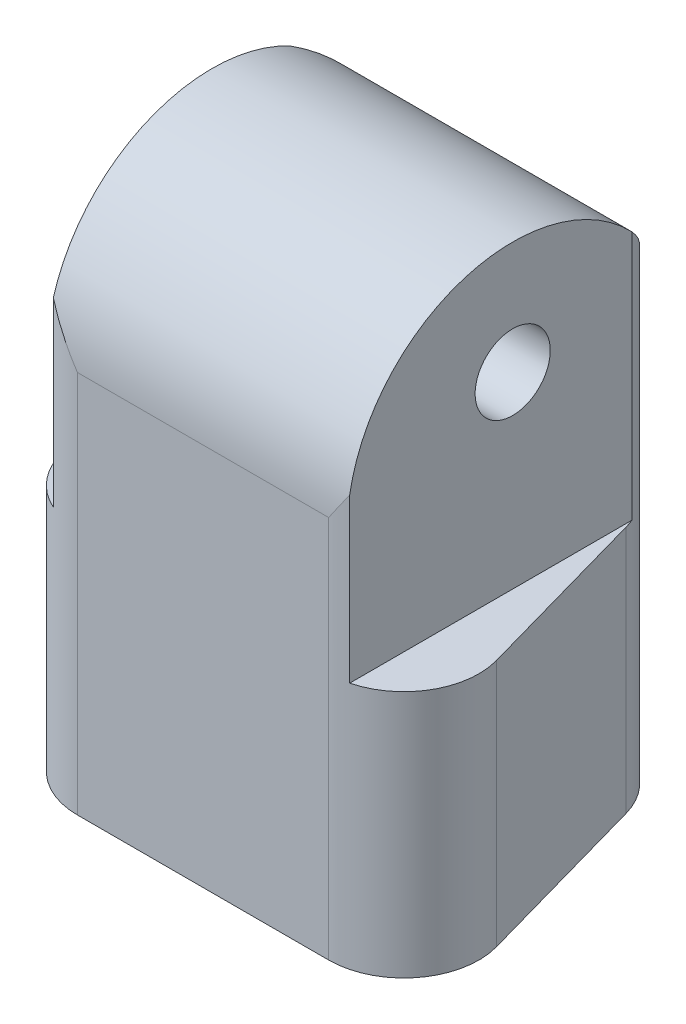
ISO-10303-21;
HEADER;
FILE_DESCRIPTION(('STEP AP214'),'2;1');
FILE_NAME('part.step','',(''),(''),'','','');
FILE_SCHEMA(('AUTOMOTIVE_DESIGN { 1 0 10303 214 1 1 1 1 }'));
ENDSEC;
DATA;
#1=APPLICATION_CONTEXT('core data for automotive mechanical design processes');
#2=APPLICATION_PROTOCOL_DEFINITION('international standard','automotive_design',2000,#1);
#3=PRODUCT_CONTEXT('',#1,'mechanical');
#4=PRODUCT('Part','Part','',(#3));
#5=PRODUCT_RELATED_PRODUCT_CATEGORY('part','',(#4));
#6=PRODUCT_DEFINITION_FORMATION('','',#4);
#7=PRODUCT_DEFINITION_CONTEXT('part definition',#1,'design');
#8=PRODUCT_DEFINITION('design','',#6,#7);
#9=PRODUCT_DEFINITION_SHAPE('','',#8);
#10=(LENGTH_UNIT() NAMED_UNIT(*) SI_UNIT(.MILLI.,.METRE.));
#11=(NAMED_UNIT(*) PLANE_ANGLE_UNIT() SI_UNIT($,.RADIAN.));
#12=(NAMED_UNIT(*) SI_UNIT($,.STERADIAN.) SOLID_ANGLE_UNIT());
#13=UNCERTAINTY_MEASURE_WITH_UNIT(LENGTH_MEASURE(1.E-05),#10,'distance_accuracy_value','');
#14=(GEOMETRIC_REPRESENTATION_CONTEXT(3) GLOBAL_UNCERTAINTY_ASSIGNED_CONTEXT((#13)) GLOBAL_UNIT_ASSIGNED_CONTEXT((#10,
#11,#12)) REPRESENTATION_CONTEXT('',''));
#15=CARTESIAN_POINT('',(0.,0.,0.));
#16=DIRECTION('',(0.,0.,1.));
#17=DIRECTION('',(1.,0.,0.));
#18=AXIS2_PLACEMENT_3D('',#15,#16,#17);
#19=CARTESIAN_POINT('',(-8.35990373267567,15.5,6.));
#20=DIRECTION('',(0.,1.,0.));
#21=DIRECTION('',(0.,0.,1.));
#22=AXIS2_PLACEMENT_3D('',#19,#20,#21);
#23=PLANE('',#22);
#24=DIRECTION('',(-1.,0.,0.));
#25=VECTOR('',#24,1.);
#26=CARTESIAN_POINT('',(-8.35990373267567,15.5,8.));
#27=LINE('',#26,#25);
#28=CARTESIAN_POINT('',(-8.35990373267567,15.5,8.));
#29=VERTEX_POINT('',#28);
#30=CARTESIAN_POINT('',(8.35990373267567,15.5,8.));
#31=VERTEX_POINT('',#30);
#32=EDGE_CURVE('E147',#29,#31,#27,.F.);
#33=ORIENTED_EDGE('',*,*,#32,.F.);
#34=CARTESIAN_POINT('',(-8.35990373267567,15.5,6.));
#35=DIRECTION('',(0.,-1.,0.));
#36=DIRECTION('',(0.,0.,-1.));
#37=AXIS2_PLACEMENT_3D('',#34,#35,#36);
#38=CIRCLE('',#37,2.);
#39=CARTESIAN_POINT('',(-10.2852056129835,15.5,5.45850884616343));
#40=VERTEX_POINT('',#39);
#41=EDGE_CURVE('E329',#29,#40,#38,.T.);
#42=ORIENTED_EDGE('',*,*,#41,.T.);
#43=DIRECTION('',(0.270745576918284,0.,-0.962650940153899));
#44=VECTOR('',#43,1.);
#45=CARTESIAN_POINT('',(-6.91020561298346,15.5,-6.54149115383657));
#46=LINE('',#45,#44);
#47=CARTESIAN_POINT('',(-6.91020561298346,15.5,-6.54149115383657));
#48=VERTEX_POINT('',#47);
#49=EDGE_CURVE('E331',#48,#40,#46,.F.);
#50=ORIENTED_EDGE('',*,*,#49,.F.);
#51=CARTESIAN_POINT('',(-4.98490373267567,15.5,-6.));
#52=DIRECTION('',(0.,-1.,0.));
#53=DIRECTION('',(0.,0.,-1.));
#54=AXIS2_PLACEMENT_3D('',#51,#52,#53);
#55=CIRCLE('',#54,2.);
#56=CARTESIAN_POINT('',(-4.98490373267567,15.5,-8.));
#57=VERTEX_POINT('',#56);
#58=EDGE_CURVE('E338',#48,#57,#55,.T.);
#59=ORIENTED_EDGE('',*,*,#58,.T.);
#60=DIRECTION('',(1.,0.,0.));
#61=VECTOR('',#60,1.);
#62=CARTESIAN_POINT('',(-4.98490373267567,15.5,-8.));
#63=LINE('',#62,#61);
#64=CARTESIAN_POINT('',(4.98490373267567,15.5,-8.));
#65=VERTEX_POINT('',#64);
#66=EDGE_CURVE('E175',#65,#57,#63,.F.);
#67=ORIENTED_EDGE('',*,*,#66,.F.);
#68=CARTESIAN_POINT('',(4.98490373267567,15.5,-6.));
#69=DIRECTION('',(0.,-1.,0.));
#70=DIRECTION('',(0.,0.,-1.));
#71=AXIS2_PLACEMENT_3D('',#68,#69,#70);
#72=CIRCLE('',#71,2.);
#73=CARTESIAN_POINT('',(6.91020561298346,15.5,-6.54149115383657));
#74=VERTEX_POINT('',#73);
#75=EDGE_CURVE('E166',#65,#74,#72,.T.);
#76=ORIENTED_EDGE('',*,*,#75,.T.);
#77=DIRECTION('',(0.270745576918284,0.,0.962650940153899));
#78=VECTOR('',#77,1.);
#79=CARTESIAN_POINT('',(6.91020561298346,15.5,-6.54149115383657));
#80=LINE('',#79,#78);
#81=CARTESIAN_POINT('',(10.2852056129835,15.5,5.45850884616344));
#82=VERTEX_POINT('',#81);
#83=EDGE_CURVE('E164',#82,#74,#80,.F.);
#84=ORIENTED_EDGE('',*,*,#83,.F.);
#85=CARTESIAN_POINT('',(8.35990373267567,15.5,6.));
#86=DIRECTION('',(0.,-1.,0.));
#87=DIRECTION('',(0.,0.,-1.));
#88=AXIS2_PLACEMENT_3D('',#85,#86,#87);
#89=CIRCLE('',#88,2.);
#90=EDGE_CURVE('E20',#82,#31,#89,.T.);
#91=ORIENTED_EDGE('',*,*,#90,.T.);
#92=EDGE_LOOP('',(#33,#42,#50,#59,#67,#76,#84,#91));
#93=FACE_BOUND('',#92,.T.);
#94=ADVANCED_FACE('F17',(#93),#23,.F.);
#95=CARTESIAN_POINT('',(-13.3599037326757,29.,0.));
#96=DIRECTION('',(1.,0.,0.));
#97=DIRECTION('',(0.,1.,0.));
#98=AXIS2_PLACEMENT_3D('',#95,#96,#97);
#99=CYLINDRICAL_SURFACE('',#98,2.5);
#100=CARTESIAN_POINT('',(-10.4,29.,0.));
#101=DIRECTION('',(1.,0.,0.));
#102=DIRECTION('',(0.,1.,0.));
#103=AXIS2_PLACEMENT_3D('',#100,#101,#102);
#104=CIRCLE('',#103,2.5);
#105=CARTESIAN_POINT('',(-10.4,31.5,0.));
#106=VERTEX_POINT('',#105);
#107=EDGE_CURVE('E324',#106,#106,#104,.F.);
#108=ORIENTED_EDGE('',*,*,#107,.T.);
#109=EDGE_LOOP('',(#108));
#110=FACE_BOUND('',#109,.T.);
#111=CARTESIAN_POINT('',(9.6,29.,0.));
#112=DIRECTION('',(1.,0.,0.));
#113=DIRECTION('',(0.,1.,0.));
#114=AXIS2_PLACEMENT_3D('',#111,#112,#113);
#115=CIRCLE('',#114,2.5);
#116=CARTESIAN_POINT('',(9.6,31.5,0.));
#117=VERTEX_POINT('',#116);
#118=EDGE_CURVE('E302',#117,#117,#115,.T.);
#119=ORIENTED_EDGE('',*,*,#118,.T.);
#120=EDGE_LOOP('',(#119));
#121=FACE_BOUND('',#120,.T.);
#122=ADVANCED_FACE('F234',(#110,#121),#99,.F.);
#123=CARTESIAN_POINT('',(-4.98490373267567,15.5,-6.));
#124=DIRECTION('',(0.,-1.,0.));
#125=DIRECTION('',(0.,0.,-1.));
#126=AXIS2_PLACEMENT_3D('',#123,#124,#125);
#127=CYLINDRICAL_SURFACE('',#126,5.);
#128=DIRECTION('',(0.,1.,0.));
#129=VECTOR('',#128,1.);
#130=CARTESIAN_POINT('',(-4.98490373267567,15.5,-11.));
#131=LINE('',#130,#129);
#132=CARTESIAN_POINT('',(-4.98490373267567,25.5,-11.));
#133=VERTEX_POINT('',#132);
#134=CARTESIAN_POINT('',(-4.98490373267567,0.,-11.));
#135=VERTEX_POINT('',#134);
#136=EDGE_CURVE('E346',#133,#135,#131,.F.);
#137=ORIENTED_EDGE('',*,*,#136,.T.);
#138=CARTESIAN_POINT('',(-4.98490373267567,0.,-6.));
#139=DIRECTION('',(0.,-1.,0.));
#140=DIRECTION('',(0.,0.,-1.));
#141=AXIS2_PLACEMENT_3D('',#138,#139,#140);
#142=CIRCLE('',#141,5.);
#143=CARTESIAN_POINT('',(-9.79815843344516,0.,-7.35372788459142));
#144=VERTEX_POINT('',#143);
#145=EDGE_CURVE('E286',#144,#135,#142,.T.);
#146=ORIENTED_EDGE('',*,*,#145,.F.);
#147=DIRECTION('',(0.,1.,0.));
#148=VECTOR('',#147,1.);
#149=CARTESIAN_POINT('',(-9.79815843344516,15.5,-7.35372788459142));
#150=LINE('',#149,#148);
#151=CARTESIAN_POINT('',(-9.79815843344516,33.6806287166319,-7.35372788459142));
#152=VERTEX_POINT('',#151);
#153=EDGE_CURVE('E313',#144,#152,#150,.T.);
#154=ORIENTED_EDGE('',*,*,#153,.T.);
#155=CARTESIAN_POINT('',(-9.79815843344516,33.6806287166319,-7.35372788459142));
#156=CARTESIAN_POINT('',(-9.75465537166528,33.5416857982639,-7.508310755183));
#157=CARTESIAN_POINT('',(-9.70459681075235,33.3993472200005,-7.65782791240288));
#158=CARTESIAN_POINT('',(-9.5931090461692,33.1089960012512,-7.94637955837493));
#159=CARTESIAN_POINT('',(-9.53169472409494,32.9609909855666,-8.08542743521852));
#160=CARTESIAN_POINT('',(-9.39951817957755,32.660975382569,-8.35227619683809));
#161=CARTESIAN_POINT('',(-9.32881525389975,32.5089947303782,-8.48014050421679));
#162=CARTESIAN_POINT('',(-9.17910942759907,32.2008478215982,-8.72567877916698));
#163=CARTESIAN_POINT('',(-9.10010244632512,32.0446795355284,-8.84334768436825));
#164=CARTESIAN_POINT('',(-8.88624715152008,31.6355588733101,-9.135102519269));
#165=CARTESIAN_POINT('',(-8.74597301968912,31.379908737895,-9.30147374999739));
#166=CARTESIAN_POINT('',(-8.45148745603848,30.8618220787066,-9.60946193009318));
#167=CARTESIAN_POINT('',(-8.29727063300848,30.5993829580834,-9.75106924137615));
#168=CARTESIAN_POINT('',(-7.97735361097041,30.0681773708773,-10.0109721230606));
#169=CARTESIAN_POINT('',(-7.81160533065112,29.7993879310691,-10.1291610689961));
#170=CARTESIAN_POINT('',(-7.4718591445137,29.2579528199758,-10.3422643826112));
#171=CARTESIAN_POINT('',(-7.29786253702083,28.9853077602927,-10.437182398823));
#172=CARTESIAN_POINT('',(-6.9507814087908,28.4480670705798,-10.6011592874501));
#173=CARTESIAN_POINT('',(-6.7779373767364,28.1835841915923,-10.6710986553213));
#174=CARTESIAN_POINT('',(-6.42822986920511,27.6527805274274,-10.7907180504656));
#175=CARTESIAN_POINT('',(-6.25136600704693,27.3864595671691,-10.8403961199525));
#176=CARTESIAN_POINT('',(-5.717804901023,26.5870950307081,-10.9593711484885));
#177=CARTESIAN_POINT('',(-5.35697976263756,26.0518782250991,-10.9991415006059));
#178=CARTESIAN_POINT('',(-4.99272103180502,25.511594931879,-10.9999954130337));
#179=CARTESIAN_POINT('',(-4.98881235046463,25.505797420609,-10.9999999961447));
#180=CARTESIAN_POINT('',(-4.98490373267567,25.5,-11.));
#181=B_SPLINE_CURVE_WITH_KNOTS('',3,(#155,#156,#157,#158,#159,#160,#161,#162,#163,#164,#165,
#166,#167,#168,#169,#170,#171,#172,#173,#174,#175,#176,#177,#178,#179,#180),.UNSPECIFIED.,.F.,
.F.,(4,2,2,2,2,2,2,2,2,2,2,2,4),(0.,0.636690201670819,1.27255186674032,1.90453544657667,
2.53683105103108,3.5424891822957,4.54853784747227,5.55906682904242,6.5694372733818,
7.53950354863581,8.50966353617129,10.443476525853,10.464452707323),.UNSPECIFIED.);
#182=EDGE_CURVE('E220',#133,#152,#181,.F.);
#183=ORIENTED_EDGE('',*,*,#182,.F.);
#184=EDGE_LOOP('',(#137,#146,#154,#183));
#185=FACE_BOUND('',#184,.T.);
#186=ADVANCED_FACE('F229',(#185),#127,.T.);
#187=CARTESIAN_POINT('',(-4.98490373267567,15.5,-11.));
#188=DIRECTION('',(0.,0.,1.));
#189=DIRECTION('',(1.,0.,0.));
#190=AXIS2_PLACEMENT_3D('',#187,#188,#189);
#191=PLANE('',#190);
#192=DIRECTION('',(1.,0.,0.));
#193=VECTOR('',#192,1.);
#194=CARTESIAN_POINT('',(-13.3599037326757,25.5,-11.));
#195=LINE('',#194,#193);
#196=CARTESIAN_POINT('',(4.98490373267566,25.5,-11.));
#197=VERTEX_POINT('',#196);
#198=EDGE_CURVE('E227',#197,#133,#195,.F.);
#199=ORIENTED_EDGE('',*,*,#198,.F.);
#200=DIRECTION('',(0.,-1.,0.));
#201=VECTOR('',#200,1.);
#202=CARTESIAN_POINT('',(4.98490373267567,15.5,-11.));
#203=LINE('',#202,#201);
#204=CARTESIAN_POINT('',(4.98490373267567,0.,-11.));
#205=VERTEX_POINT('',#204);
#206=EDGE_CURVE('E156',#205,#197,#203,.F.);
#207=ORIENTED_EDGE('',*,*,#206,.F.);
#208=DIRECTION('',(1.,0.,0.));
#209=VECTOR('',#208,1.);
#210=CARTESIAN_POINT('',(-8.35990373267567,0.,-11.));
#211=LINE('',#210,#209);
#212=EDGE_CURVE('E284',#135,#205,#211,.T.);
#213=ORIENTED_EDGE('',*,*,#212,.F.);
#214=ORIENTED_EDGE('',*,*,#136,.F.);
#215=EDGE_LOOP('',(#199,#207,#213,#214));
#216=FACE_BOUND('',#215,.T.);
#217=ADVANCED_FACE('F233',(#216),#191,.F.);
#218=CARTESIAN_POINT('',(4.98490373267567,15.5,-6.));
#219=DIRECTION('',(0.,-1.,0.));
#220=DIRECTION('',(0.,0.,-1.));
#221=AXIS2_PLACEMENT_3D('',#218,#219,#220);
#222=CYLINDRICAL_SURFACE('',#221,5.);
#223=DIRECTION('',(0.,1.,0.));
#224=VECTOR('',#223,1.);
#225=CARTESIAN_POINT('',(9.79815843344516,15.5,-7.35372788459142));
#226=LINE('',#225,#224);
#227=CARTESIAN_POINT('',(9.79815843344516,16.5,-7.35372788459142));
#228=VERTEX_POINT('',#227);
#229=CARTESIAN_POINT('',(9.79815843344516,0.,-7.35372788459142));
#230=VERTEX_POINT('',#229);
#231=EDGE_CURVE('E297',#228,#230,#226,.F.);
#232=ORIENTED_EDGE('',*,*,#231,.T.);
#233=CARTESIAN_POINT('',(4.98490373267567,0.,-6.));
#234=DIRECTION('',(0.,-1.,0.));
#235=DIRECTION('',(0.,0.,-1.));
#236=AXIS2_PLACEMENT_3D('',#233,#234,#235);
#237=CIRCLE('',#236,5.);
#238=EDGE_CURVE('E283',#205,#230,#237,.T.);
#239=ORIENTED_EDGE('',*,*,#238,.F.);
#240=ORIENTED_EDGE('',*,*,#206,.T.);
#241=CARTESIAN_POINT('',(9.6,33.1298026061361,-7.9237688123392));
#242=CARTESIAN_POINT('',(9.56163664547103,33.0342353420459,-8.01579032156855));
#243=CARTESIAN_POINT('',(9.52097540059839,32.9375063776605,-8.10559890241591));
#244=CARTESIAN_POINT('',(9.43547048312118,32.7419537246073,-8.28078114646149));
#245=CARTESIAN_POINT('',(9.390627954097,32.6431306143684,-8.36615601239206));
#246=CARTESIAN_POINT('',(9.25058998000587,32.3441578836276,-8.61537798100348));
#247=CARTESIAN_POINT('',(9.14973728175387,32.1411450508689,-8.77266729742175));
#248=CARTESIAN_POINT('',(8.93630659115382,31.7301380800139,-9.06913955858471));
#249=CARTESIAN_POINT('',(8.82379039612597,31.5221742817908,-9.20840994555235));
#250=CARTESIAN_POINT('',(8.58877746407701,31.1013093608718,-9.4703113179386));
#251=CARTESIAN_POINT('',(8.46627481569776,30.8884053680106,-9.59293233181453));
#252=CARTESIAN_POINT('',(8.16200438008174,30.3717763851635,-9.86826959305268));
#253=CARTESIAN_POINT('',(7.97630646578129,30.0661470652188,-10.013098323204));
#254=CARTESIAN_POINT('',(7.5931731985051,29.4492968816606,-10.2720493078069));
#255=CARTESIAN_POINT('',(7.39573435660451,29.1380743753449,-10.3861623785829));
#256=CARTESIAN_POINT('',(6.99211232451004,28.5111569238292,-10.5849540303162));
#257=CARTESIAN_POINT('',(6.78591451641532,28.1954551386322,-10.6695810479188));
#258=CARTESIAN_POINT('',(6.36794738015988,27.5615494094436,-10.8099652172124));
#259=CARTESIAN_POINT('',(6.15618048954037,27.2433466015203,-10.8657347856396));
#260=CARTESIAN_POINT('',(5.786175932868,26.6903018661787,-10.9379580740207));
#261=CARTESIAN_POINT('',(5.62867425909706,26.4557876071748,-10.9609223057748));
#262=CARTESIAN_POINT('',(5.31298340299101,25.9866315483334,-10.991741020609));
#263=CARTESIAN_POINT('',(5.1547953989711,25.7519903230144,-10.9996153590487));
#264=CARTESIAN_POINT('',(4.99272107423561,25.5115949916086,-10.9999954156931));
#265=CARTESIAN_POINT('',(4.98881239308483,25.5057974805713,-10.9999999989226));
#266=CARTESIAN_POINT('',(4.98490373267567,25.5,-11.));
#267=B_SPLINE_CURVE_WITH_KNOTS('',3,(#241,#242,#243,#244,#245,#246,#247,#248,#249,#250,#251,
#252,#253,#254,#255,#256,#257,#258,#259,#260,#261,#262,#263,#264,#265,#266),.UNSPECIFIED.,.F.,
.F.,(4,2,2,2,2,2,2,2,2,2,2,2,4),(0.,0.414216272896109,0.828319588169892,1.65497331820252,
2.47745163029384,3.30042038359185,4.45625329874215,5.61243141348735,6.77062134999504,
7.92831252716345,8.77823439087445,9.62703715306525,9.64801333453527),.UNSPECIFIED.);
#268=CARTESIAN_POINT('',(9.6,33.1298026061361,-7.9237688123392));
#269=VERTEX_POINT('',#268);
#270=EDGE_CURVE('E213',#269,#197,#267,.T.);
#271=ORIENTED_EDGE('',*,*,#270,.F.);
#272=DIRECTION('',(0.,1.,0.));
#273=VECTOR('',#272,1.);
#274=CARTESIAN_POINT('',(9.6,36.5,-7.92376881233919));
#275=LINE('',#274,#273);
#276=CARTESIAN_POINT('',(9.6,16.5,-7.92376881233919));
#277=VERTEX_POINT('',#276);
#278=EDGE_CURVE('E300',#269,#277,#275,.F.);
#279=ORIENTED_EDGE('',*,*,#278,.T.);
#280=CARTESIAN_POINT('',(4.98490373267567,16.5,-6.));
#281=DIRECTION('',(0.,-1.,0.));
#282=DIRECTION('',(0.,0.,-1.));
#283=AXIS2_PLACEMENT_3D('',#280,#281,#282);
#284=CIRCLE('',#283,5.);
#285=EDGE_CURVE('E293',#277,#228,#284,.T.);
#286=ORIENTED_EDGE('',*,*,#285,.T.);
#287=EDGE_LOOP('',(#232,#239,#240,#271,#279,#286));
#288=FACE_BOUND('',#287,.T.);
#289=ADVANCED_FACE('F413',(#288),#222,.T.);
#290=CARTESIAN_POINT('',(-8.35990373267567,15.5,8.));
#291=DIRECTION('',(0.,0.,-1.));
#292=DIRECTION('',(-1.,0.,0.));
#293=AXIS2_PLACEMENT_3D('',#290,#291,#292);
#294=PLANE('',#293);
#295=ORIENTED_EDGE('',*,*,#32,.T.);
#296=DIRECTION('',(0.,-1.,0.));
#297=VECTOR('',#296,1.);
#298=CARTESIAN_POINT('',(8.35990373267567,15.5,8.));
#299=LINE('',#298,#297);
#300=CARTESIAN_POINT('',(8.35990373267567,0.,8.));
#301=VERTEX_POINT('',#300);
#302=EDGE_CURVE('E150',#31,#301,#299,.T.);
#303=ORIENTED_EDGE('',*,*,#302,.T.);
#304=DIRECTION('',(1.,0.,0.));
#305=VECTOR('',#304,1.);
#306=CARTESIAN_POINT('',(-8.35990373267567,0.,8.));
#307=LINE('',#306,#305);
#308=CARTESIAN_POINT('',(-8.35990373267567,0.,8.));
#309=VERTEX_POINT('',#308);
#310=EDGE_CURVE('E278',#309,#301,#307,.T.);
#311=ORIENTED_EDGE('',*,*,#310,.F.);
#312=DIRECTION('',(0.,-1.,0.));
#313=VECTOR('',#312,1.);
#314=CARTESIAN_POINT('',(-8.35990373267567,15.5,8.));
#315=LINE('',#314,#313);
#316=EDGE_CURVE('E152',#309,#29,#315,.F.);
#317=ORIENTED_EDGE('',*,*,#316,.T.);
#318=EDGE_LOOP('',(#295,#303,#311,#317));
#319=FACE_BOUND('',#318,.T.);
#320=ADVANCED_FACE('F148',(#319),#294,.T.);
#321=CARTESIAN_POINT('',(8.35990373267567,15.5,6.));
#322=DIRECTION('',(0.,-1.,0.));
#323=DIRECTION('',(0.,0.,-1.));
#324=AXIS2_PLACEMENT_3D('',#321,#322,#323);
#325=CYLINDRICAL_SURFACE('',#324,2.);
#326=ORIENTED_EDGE('',*,*,#302,.F.);
#327=ORIENTED_EDGE('',*,*,#90,.F.);
#328=DIRECTION('',(0.,1.,0.));
#329=VECTOR('',#328,1.);
#330=CARTESIAN_POINT('',(10.2852056129835,15.5,5.45850884616344));
#331=LINE('',#330,#329);
#332=CARTESIAN_POINT('',(10.2852056129835,0.,5.45850884616344));
#333=VERTEX_POINT('',#332);
#334=EDGE_CURVE('E160',#333,#82,#331,.T.);
#335=ORIENTED_EDGE('',*,*,#334,.F.);
#336=CARTESIAN_POINT('',(8.35990373267567,0.,6.));
#337=DIRECTION('',(0.,-1.,0.));
#338=DIRECTION('',(0.,0.,-1.));
#339=AXIS2_PLACEMENT_3D('',#336,#337,#338);
#340=CIRCLE('',#339,2.);
#341=EDGE_CURVE('E159',#301,#333,#340,.F.);
#342=ORIENTED_EDGE('',*,*,#341,.F.);
#343=EDGE_LOOP('',(#326,#327,#335,#342));
#344=FACE_BOUND('',#343,.T.);
#345=ADVANCED_FACE('F158',(#344),#325,.F.);
#346=CARTESIAN_POINT('',(6.91020561298346,15.5,-6.54149115383657));
#347=DIRECTION('',(-0.962650940153899,0.,0.270745576918284));
#348=DIRECTION('',(0.270745576918284,0.,0.962650940153899));
#349=AXIS2_PLACEMENT_3D('',#346,#347,#348);
#350=PLANE('',#349);
#351=ORIENTED_EDGE('',*,*,#83,.T.);
#352=DIRECTION('',(0.,-1.,0.));
#353=VECTOR('',#352,1.);
#354=CARTESIAN_POINT('',(6.91020561298346,15.5,-6.54149115383657));
#355=LINE('',#354,#353);
#356=CARTESIAN_POINT('',(6.91020561298346,0.,-6.54149115383657));
#357=VERTEX_POINT('',#356);
#358=EDGE_CURVE('E171',#74,#357,#355,.T.);
#359=ORIENTED_EDGE('',*,*,#358,.T.);
#360=DIRECTION('',(-0.270745576918284,0.,-0.962650940153899));
#361=VECTOR('',#360,1.);
#362=CARTESIAN_POINT('',(10.2852056129835,0.,5.45850884616343));
#363=LINE('',#362,#361);
#364=EDGE_CURVE('E276',#333,#357,#363,.T.);
#365=ORIENTED_EDGE('',*,*,#364,.F.);
#366=ORIENTED_EDGE('',*,*,#334,.T.);
#367=EDGE_LOOP('',(#351,#359,#365,#366));
#368=FACE_BOUND('',#367,.T.);
#369=ADVANCED_FACE('F446',(#368),#350,.T.);
#370=CARTESIAN_POINT('',(4.98490373267567,15.5,-6.));
#371=DIRECTION('',(0.,-1.,0.));
#372=DIRECTION('',(0.,0.,-1.));
#373=AXIS2_PLACEMENT_3D('',#370,#371,#372);
#374=CYLINDRICAL_SURFACE('',#373,2.);
#375=ORIENTED_EDGE('',*,*,#358,.F.);
#376=ORIENTED_EDGE('',*,*,#75,.F.);
#377=DIRECTION('',(0.,1.,0.));
#378=VECTOR('',#377,1.);
#379=CARTESIAN_POINT('',(4.98490373267567,15.5,-8.));
#380=LINE('',#379,#378);
#381=CARTESIAN_POINT('',(4.98490373267567,0.,-8.));
#382=VERTEX_POINT('',#381);
#383=EDGE_CURVE('E339',#382,#65,#380,.T.);
#384=ORIENTED_EDGE('',*,*,#383,.F.);
#385=CARTESIAN_POINT('',(4.98490373267567,0.,-6.));
#386=DIRECTION('',(0.,-1.,0.));
#387=DIRECTION('',(0.,0.,-1.));
#388=AXIS2_PLACEMENT_3D('',#385,#386,#387);
#389=CIRCLE('',#388,2.);
#390=EDGE_CURVE('E275',#357,#382,#389,.F.);
#391=ORIENTED_EDGE('',*,*,#390,.F.);
#392=EDGE_LOOP('',(#375,#376,#384,#391));
#393=FACE_BOUND('',#392,.T.);
#394=ADVANCED_FACE('F449',(#393),#374,.F.);
#395=CARTESIAN_POINT('',(-4.98490373267567,15.5,-8.));
#396=DIRECTION('',(0.,0.,1.));
#397=DIRECTION('',(1.,0.,0.));
#398=AXIS2_PLACEMENT_3D('',#395,#396,#397);
#399=PLANE('',#398);
#400=ORIENTED_EDGE('',*,*,#66,.T.);
#401=DIRECTION('',(0.,-1.,0.));
#402=VECTOR('',#401,1.);
#403=CARTESIAN_POINT('',(-4.98490373267567,15.5,-8.));
#404=LINE('',#403,#402);
#405=CARTESIAN_POINT('',(-4.98490373267567,0.,-8.));
#406=VERTEX_POINT('',#405);
#407=EDGE_CURVE('E335',#57,#406,#404,.T.);
#408=ORIENTED_EDGE('',*,*,#407,.T.);
#409=DIRECTION('',(1.,0.,0.));
#410=VECTOR('',#409,1.);
#411=CARTESIAN_POINT('',(-8.35990373267567,0.,-8.));
#412=LINE('',#411,#410);
#413=EDGE_CURVE('E273',#382,#406,#412,.F.);
#414=ORIENTED_EDGE('',*,*,#413,.F.);
#415=ORIENTED_EDGE('',*,*,#383,.T.);
#416=EDGE_LOOP('',(#400,#408,#414,#415));
#417=FACE_BOUND('',#416,.T.);
#418=ADVANCED_FACE('F363',(#417),#399,.T.);
#419=CARTESIAN_POINT('',(-4.98490373267567,15.5,-6.));
#420=DIRECTION('',(0.,-1.,0.));
#421=DIRECTION('',(0.,0.,-1.));
#422=AXIS2_PLACEMENT_3D('',#419,#420,#421);
#423=CYLINDRICAL_SURFACE('',#422,2.);
#424=ORIENTED_EDGE('',*,*,#407,.F.);
#425=ORIENTED_EDGE('',*,*,#58,.F.);
#426=DIRECTION('',(0.,1.,0.));
#427=VECTOR('',#426,1.);
#428=CARTESIAN_POINT('',(-6.91020561298346,15.5,-6.54149115383657));
#429=LINE('',#428,#427);
#430=CARTESIAN_POINT('',(-6.91020561298346,0.,-6.54149115383657));
#431=VERTEX_POINT('',#430);
#432=EDGE_CURVE('E332',#431,#48,#429,.T.);
#433=ORIENTED_EDGE('',*,*,#432,.F.);
#434=CARTESIAN_POINT('',(-4.98490373267567,0.,-6.));
#435=DIRECTION('',(0.,-1.,0.));
#436=DIRECTION('',(0.,0.,-1.));
#437=AXIS2_PLACEMENT_3D('',#434,#435,#436);
#438=CIRCLE('',#437,2.);
#439=EDGE_CURVE('E272',#406,#431,#438,.F.);
#440=ORIENTED_EDGE('',*,*,#439,.F.);
#441=EDGE_LOOP('',(#424,#425,#433,#440));
#442=FACE_BOUND('',#441,.T.);
#443=ADVANCED_FACE('F368',(#442),#423,.F.);
#444=CARTESIAN_POINT('',(-6.91020561298346,15.5,-6.54149115383657));
#445=DIRECTION('',(0.962650940153899,0.,0.270745576918284));
#446=DIRECTION('',(0.270745576918284,0.,-0.962650940153899));
#447=AXIS2_PLACEMENT_3D('',#444,#445,#446);
#448=PLANE('',#447);
#449=ORIENTED_EDGE('',*,*,#49,.T.);
#450=DIRECTION('',(0.,-1.,0.));
#451=VECTOR('',#450,1.);
#452=CARTESIAN_POINT('',(-10.2852056129835,15.5,5.45850884616343));
#453=LINE('',#452,#451);
#454=CARTESIAN_POINT('',(-10.2852056129835,0.,5.45850884616343));
#455=VERTEX_POINT('',#454);
#456=EDGE_CURVE('E319',#40,#455,#453,.T.);
#457=ORIENTED_EDGE('',*,*,#456,.T.);
#458=DIRECTION('',(-0.270745576918284,0.,0.962650940153899));
#459=VECTOR('',#458,1.);
#460=CARTESIAN_POINT('',(-6.91020561298346,0.,-6.54149115383657));
#461=LINE('',#460,#459);
#462=EDGE_CURVE('E270',#431,#455,#461,.T.);
#463=ORIENTED_EDGE('',*,*,#462,.F.);
#464=ORIENTED_EDGE('',*,*,#432,.T.);
#465=EDGE_LOOP('',(#449,#457,#463,#464));
#466=FACE_BOUND('',#465,.T.);
#467=ADVANCED_FACE('F352',(#466),#448,.T.);
#468=CARTESIAN_POINT('',(-8.35990373267567,15.5,6.));
#469=DIRECTION('',(0.,-1.,0.));
#470=DIRECTION('',(0.,0.,-1.));
#471=AXIS2_PLACEMENT_3D('',#468,#469,#470);
#472=CYLINDRICAL_SURFACE('',#471,2.);
#473=ORIENTED_EDGE('',*,*,#456,.F.);
#474=ORIENTED_EDGE('',*,*,#41,.F.);
#475=ORIENTED_EDGE('',*,*,#316,.F.);
#476=CARTESIAN_POINT('',(-8.35990373267567,0.,6.));
#477=DIRECTION('',(0.,-1.,0.));
#478=DIRECTION('',(0.,0.,-1.));
#479=AXIS2_PLACEMENT_3D('',#476,#477,#478);
#480=CIRCLE('',#479,2.);
#481=EDGE_CURVE('E269',#455,#309,#480,.F.);
#482=ORIENTED_EDGE('',*,*,#481,.F.);
#483=EDGE_LOOP('',(#473,#474,#475,#482));
#484=FACE_BOUND('',#483,.T.);
#485=ADVANCED_FACE('F358',(#484),#472,.F.);
#486=CARTESIAN_POINT('',(-15.4,16.5,-11.));
#487=DIRECTION('',(0.,-1.,0.));
#488=DIRECTION('',(0.,0.,-1.));
#489=AXIS2_PLACEMENT_3D('',#486,#487,#488);
#490=PLANE('',#489);
#491=DIRECTION('',(0.270745576918284,0.,-0.962650940153899));
#492=VECTOR('',#491,1.);
#493=CARTESIAN_POINT('',(-9.79815843344516,16.5,-7.35372788459142));
#494=LINE('',#493,#492);
#495=CARTESIAN_POINT('',(-10.4,16.5,-5.21384675906311));
#496=VERTEX_POINT('',#495);
#497=CARTESIAN_POINT('',(-13.1731584334452,16.5,4.64627211540858));
#498=VERTEX_POINT('',#497);
#499=EDGE_CURVE('E316',#496,#498,#494,.F.);
#500=ORIENTED_EDGE('',*,*,#499,.T.);
#501=CARTESIAN_POINT('',(-8.35990373267567,16.5,6.));
#502=DIRECTION('',(0.,-1.,0.));
#503=DIRECTION('',(0.,0.,-1.));
#504=AXIS2_PLACEMENT_3D('',#501,#502,#503);
#505=CIRCLE('',#504,5.);
#506=CARTESIAN_POINT('',(-10.4,16.5,10.5648666158004));
#507=VERTEX_POINT('',#506);
#508=EDGE_CURVE('E268',#507,#498,#505,.T.);
#509=ORIENTED_EDGE('',*,*,#508,.F.);
#510=DIRECTION('',(0.,0.,1.));
#511=VECTOR('',#510,1.);
#512=CARTESIAN_POINT('',(-10.4,16.5,-11.));
#513=LINE('',#512,#511);
#514=EDGE_CURVE('E306',#507,#496,#513,.F.);
#515=ORIENTED_EDGE('',*,*,#514,.T.);
#516=EDGE_LOOP('',(#500,#509,#515));
#517=FACE_BOUND('',#516,.T.);
#518=ADVANCED_FACE('F398',(#517),#490,.F.);
#519=CARTESIAN_POINT('',(-9.79815843344516,15.5,-7.35372788459142));
#520=DIRECTION('',(0.962650940153899,0.,0.270745576918284));
#521=DIRECTION('',(0.270745576918284,0.,-0.962650940153899));
#522=AXIS2_PLACEMENT_3D('',#519,#520,#521);
#523=PLANE('',#522);
#524=CARTESIAN_POINT('',(-11.8663944009865,25.5,0.));
#525=DIRECTION('',(0.962650940153899,0.,0.270745576918284));
#526=DIRECTION('',(0.270745576918284,0.,-0.962650940153899));
#527=AXIS2_PLACEMENT_3D('',#524,#525,#526);
#528=ELLIPSE('',#527,11.4267794702838,11.);
#529=CARTESIAN_POINT('',(-10.4,35.185855768749,-5.2138467590631));
#530=VERTEX_POINT('',#529);
#531=EDGE_CURVE('E226',#152,#530,#528,.T.);
#532=ORIENTED_EDGE('',*,*,#531,.F.);
#533=ORIENTED_EDGE('',*,*,#153,.F.);
#534=DIRECTION('',(0.270745576918284,0.,-0.962650940153899));
#535=VECTOR('',#534,1.);
#536=CARTESIAN_POINT('',(-13.1731584334452,0.,4.64627211540858));
#537=LINE('',#536,#535);
#538=CARTESIAN_POINT('',(-13.1731584334452,0.,4.64627211540858));
#539=VERTEX_POINT('',#538);
#540=EDGE_CURVE('E287',#539,#144,#537,.T.);
#541=ORIENTED_EDGE('',*,*,#540,.F.);
#542=DIRECTION('',(0.,-1.,0.));
#543=VECTOR('',#542,1.);
#544=CARTESIAN_POINT('',(-13.1731584334452,15.5,4.64627211540859));
#545=LINE('',#544,#543);
#546=EDGE_CURVE('E311',#498,#539,#545,.T.);
#547=ORIENTED_EDGE('',*,*,#546,.F.);
#548=ORIENTED_EDGE('',*,*,#499,.F.);
#549=DIRECTION('',(0.,1.,0.));
#550=VECTOR('',#549,1.);
#551=CARTESIAN_POINT('',(-10.4,36.5,-5.21384675906311));
#552=LINE('',#551,#550);
#553=EDGE_CURVE('E303',#496,#530,#552,.T.);
#554=ORIENTED_EDGE('',*,*,#553,.T.);
#555=EDGE_LOOP('',(#532,#533,#541,#547,#548,#554));
#556=FACE_BOUND('',#555,.T.);
#557=ADVANCED_FACE('F390',(#556),#523,.F.);
#558=CARTESIAN_POINT('',(-10.4,36.5,-11.));
#559=DIRECTION('',(1.,0.,0.));
#560=DIRECTION('',(0.,1.,0.));
#561=AXIS2_PLACEMENT_3D('',#558,#559,#560);
#562=PLANE('',#561);
#563=CARTESIAN_POINT('',(-10.4,25.5,0.));
#564=DIRECTION('',(1.,0.,0.));
#565=DIRECTION('',(0.,1.,0.));
#566=AXIS2_PLACEMENT_3D('',#563,#564,#565);
#567=CIRCLE('',#566,11.);
#568=CARTESIAN_POINT('',(-10.4,28.5632651518185,10.5648666158004));
#569=VERTEX_POINT('',#568);
#570=EDGE_CURVE('E384',#530,#569,#567,.T.);
#571=ORIENTED_EDGE('',*,*,#570,.F.);
#572=ORIENTED_EDGE('',*,*,#553,.F.);
#573=ORIENTED_EDGE('',*,*,#514,.F.);
#574=DIRECTION('',(0.,-1.,0.));
#575=VECTOR('',#574,1.);
#576=CARTESIAN_POINT('',(-10.4,15.5,10.5648666158004));
#577=LINE('',#576,#575);
#578=EDGE_CURVE('E266',#569,#507,#577,.T.);
#579=ORIENTED_EDGE('',*,*,#578,.F.);
#580=EDGE_LOOP('',(#571,#572,#573,#579));
#581=FACE_BOUND('',#580,.T.);
#582=ORIENTED_EDGE('',*,*,#107,.F.);
#583=EDGE_LOOP('',(#582));
#584=FACE_BOUND('',#583,.T.);
#585=ADVANCED_FACE('F393',(#581,#584),#562,.F.);
#586=CARTESIAN_POINT('',(9.6,36.5,-11.));
#587=DIRECTION('',(-1.,0.,0.));
#588=DIRECTION('',(0.,0.,1.));
#589=AXIS2_PLACEMENT_3D('',#586,#587,#588);
#590=PLANE('',#589);
#591=ORIENTED_EDGE('',*,*,#278,.F.);
#592=CARTESIAN_POINT('',(9.6,25.5,0.));
#593=DIRECTION('',(1.,0.,0.));
#594=DIRECTION('',(0.,1.,0.));
#595=AXIS2_PLACEMENT_3D('',#592,#593,#594);
#596=CIRCLE('',#595,11.);
#597=CARTESIAN_POINT('',(9.6,27.3473041336646,10.8437755158315));
#598=VERTEX_POINT('',#597);
#599=EDGE_CURVE('E191',#598,#269,#596,.F.);
#600=ORIENTED_EDGE('',*,*,#599,.F.);
#601=DIRECTION('',(0.,-1.,0.));
#602=VECTOR('',#601,1.);
#603=CARTESIAN_POINT('',(9.6,15.5,10.8437755158315));
#604=LINE('',#603,#602);
#605=CARTESIAN_POINT('',(9.6,16.5,10.8437755158315));
#606=VERTEX_POINT('',#605);
#607=EDGE_CURVE('E190',#606,#598,#604,.F.);
#608=ORIENTED_EDGE('',*,*,#607,.F.);
#609=DIRECTION('',(0.,0.,-1.));
#610=VECTOR('',#609,1.);
#611=CARTESIAN_POINT('',(9.6,16.5,-11.));
#612=LINE('',#611,#610);
#613=EDGE_CURVE('E294',#606,#277,#612,.T.);
#614=ORIENTED_EDGE('',*,*,#613,.T.);
#615=EDGE_LOOP('',(#591,#600,#608,#614));
#616=FACE_BOUND('',#615,.T.);
#617=ORIENTED_EDGE('',*,*,#118,.F.);
#618=EDGE_LOOP('',(#617));
#619=FACE_BOUND('',#618,.T.);
#620=ADVANCED_FACE('F408',(#616,#619),#590,.F.);
#621=CARTESIAN_POINT('',(9.79815843344516,15.5,-7.35372788459142));
#622=DIRECTION('',(-0.962650940153899,0.,0.270745576918284));
#623=DIRECTION('',(0.270745576918284,0.,0.962650940153899));
#624=AXIS2_PLACEMENT_3D('',#621,#622,#623);
#625=PLANE('',#624);
#626=DIRECTION('',(0.270745576918284,0.,0.962650940153899));
#627=VECTOR('',#626,1.);
#628=CARTESIAN_POINT('',(9.79815843344516,16.5,-7.35372788459142));
#629=LINE('',#628,#627);
#630=CARTESIAN_POINT('',(13.1731584334452,16.5,4.64627211540858));
#631=VERTEX_POINT('',#630);
#632=EDGE_CURVE('E290',#228,#631,#629,.T.);
#633=ORIENTED_EDGE('',*,*,#632,.T.);
#634=DIRECTION('',(0.,-1.,0.));
#635=VECTOR('',#634,1.);
#636=CARTESIAN_POINT('',(13.1731584334452,15.5,4.64627211540858));
#637=LINE('',#636,#635);
#638=CARTESIAN_POINT('',(13.1731584334452,0.,4.64627211540858));
#639=VERTEX_POINT('',#638);
#640=EDGE_CURVE('E180',#639,#631,#637,.F.);
#641=ORIENTED_EDGE('',*,*,#640,.F.);
#642=DIRECTION('',(0.270745576918284,0.,0.962650940153899));
#643=VECTOR('',#642,1.);
#644=CARTESIAN_POINT('',(9.79815843344516,0.,-7.35372788459142));
#645=LINE('',#644,#643);
#646=EDGE_CURVE('E280',#230,#639,#645,.T.);
#647=ORIENTED_EDGE('',*,*,#646,.F.);
#648=ORIENTED_EDGE('',*,*,#231,.F.);
#649=EDGE_LOOP('',(#633,#641,#647,#648));
#650=FACE_BOUND('',#649,.T.);
#651=ADVANCED_FACE('F420',(#650),#625,.F.);
#652=CARTESIAN_POINT('',(9.6,16.5,-11.));
#653=DIRECTION('',(0.,-1.,0.));
#654=DIRECTION('',(0.,0.,-1.));
#655=AXIS2_PLACEMENT_3D('',#652,#653,#654);
#656=PLANE('',#655);
#657=ORIENTED_EDGE('',*,*,#285,.F.);
#658=ORIENTED_EDGE('',*,*,#613,.F.);
#659=CARTESIAN_POINT('',(8.35990373267567,16.5,6.));
#660=DIRECTION('',(0.,-1.,0.));
#661=DIRECTION('',(0.,0.,-1.));
#662=AXIS2_PLACEMENT_3D('',#659,#660,#661);
#663=CIRCLE('',#662,5.);
#664=EDGE_CURVE('E176',#631,#606,#663,.T.);
#665=ORIENTED_EDGE('',*,*,#664,.F.);
#666=ORIENTED_EDGE('',*,*,#632,.F.);
#667=EDGE_LOOP('',(#657,#658,#665,#666));
#668=FACE_BOUND('',#667,.T.);
#669=ADVANCED_FACE('F416',(#668),#656,.F.);
#670=CARTESIAN_POINT('',(-8.35990373267567,0.,6.));
#671=DIRECTION('',(0.,-1.,0.));
#672=DIRECTION('',(0.,0.,-1.));
#673=AXIS2_PLACEMENT_3D('',#670,#671,#672);
#674=PLANE('',#673);
#675=ORIENTED_EDGE('',*,*,#462,.T.);
#676=ORIENTED_EDGE('',*,*,#481,.T.);
#677=ORIENTED_EDGE('',*,*,#310,.T.);
#678=ORIENTED_EDGE('',*,*,#341,.T.);
#679=ORIENTED_EDGE('',*,*,#364,.T.);
#680=ORIENTED_EDGE('',*,*,#390,.T.);
#681=ORIENTED_EDGE('',*,*,#413,.T.);
#682=ORIENTED_EDGE('',*,*,#439,.T.);
#683=EDGE_LOOP('',(#675,#676,#677,#678,#679,#680,#681,#682));
#684=FACE_BOUND('',#683,.T.);
#685=CARTESIAN_POINT('',(8.35990373267567,0.,6.));
#686=DIRECTION('',(0.,-1.,0.));
#687=DIRECTION('',(0.,0.,-1.));
#688=AXIS2_PLACEMENT_3D('',#685,#686,#687);
#689=CIRCLE('',#688,5.);
#690=CARTESIAN_POINT('',(8.35990373267567,0.,11.));
#691=VERTEX_POINT('',#690);
#692=EDGE_CURVE('E181',#691,#639,#689,.F.);
#693=ORIENTED_EDGE('',*,*,#692,.F.);
#694=DIRECTION('',(-1.,0.,0.));
#695=VECTOR('',#694,1.);
#696=CARTESIAN_POINT('',(-8.35990373267567,0.,11.));
#697=LINE('',#696,#695);
#698=CARTESIAN_POINT('',(-8.35990373267567,0.,11.));
#699=VERTEX_POINT('',#698);
#700=EDGE_CURVE('E179',#691,#699,#697,.T.);
#701=ORIENTED_EDGE('',*,*,#700,.T.);
#702=CARTESIAN_POINT('',(-8.35990373267567,0.,6.));
#703=DIRECTION('',(0.,-1.,0.));
#704=DIRECTION('',(0.,0.,-1.));
#705=AXIS2_PLACEMENT_3D('',#702,#703,#704);
#706=CIRCLE('',#705,5.);
#707=EDGE_CURVE('E262',#539,#699,#706,.F.);
#708=ORIENTED_EDGE('',*,*,#707,.F.);
#709=ORIENTED_EDGE('',*,*,#540,.T.);
#710=ORIENTED_EDGE('',*,*,#145,.T.);
#711=ORIENTED_EDGE('',*,*,#212,.T.);
#712=ORIENTED_EDGE('',*,*,#238,.T.);
#713=ORIENTED_EDGE('',*,*,#646,.T.);
#714=EDGE_LOOP('',(#693,#701,#708,#709,#710,#711,#712,#713));
#715=FACE_BOUND('',#714,.T.);
#716=ADVANCED_FACE('F426',(#684,#715),#674,.T.);
#717=CARTESIAN_POINT('',(-8.35990373267567,15.5,6.));
#718=DIRECTION('',(0.,-1.,0.));
#719=DIRECTION('',(0.,0.,-1.));
#720=AXIS2_PLACEMENT_3D('',#717,#718,#719);
#721=CYLINDRICAL_SURFACE('',#720,5.);
#722=ORIENTED_EDGE('',*,*,#546,.T.);
#723=ORIENTED_EDGE('',*,*,#707,.T.);
#724=DIRECTION('',(0.,1.,0.));
#725=VECTOR('',#724,1.);
#726=CARTESIAN_POINT('',(-8.35990373267567,15.5,11.));
#727=LINE('',#726,#725);
#728=CARTESIAN_POINT('',(-8.35990373267567,25.5,11.));
#729=VERTEX_POINT('',#728);
#730=EDGE_CURVE('E255',#699,#729,#727,.T.);
#731=ORIENTED_EDGE('',*,*,#730,.T.);
#732=CARTESIAN_POINT('',(-10.4,28.5632651518185,10.5648666158004));
#733=CARTESIAN_POINT('',(-10.2366342342713,28.3114871295651,10.6378447801393));
#734=CARTESIAN_POINT('',(-10.070872230505,28.0585900938418,10.7014397002487));
#735=CARTESIAN_POINT('',(-9.73579068303608,27.5511041782719,10.8102017709335));
#736=CARTESIAN_POINT('',(-9.56647035389769,27.2965149335628,10.8553648071124));
#737=CARTESIAN_POINT('',(-9.22674517454616,26.7880459110285,10.9273229950101));
#738=CARTESIAN_POINT('',(-9.05635562856143,26.5341731625022,10.9542414839128));
#739=CARTESIAN_POINT('',(-8.71451106915853,26.0259799521669,10.9903688400778));
#740=CARTESIAN_POINT('',(-8.54305647519841,25.7716596917858,10.9995842845458));
#741=CARTESIAN_POINT('',(-8.36772107342262,25.5115949905612,10.9999954151912));
#742=CARTESIAN_POINT('',(-8.36381239229138,25.5057974795581,10.9999999984044));
#743=CARTESIAN_POINT('',(-8.35990373267567,25.5,11.));
#744=B_SPLINE_CURVE_WITH_KNOTS('',3,(#732,#733,#734,#735,#736,#737,#738,#739,#740,#741,#742,
#743),.UNSPECIFIED.,.F.,.F.,(4,2,2,2,2,4),(0.,0.926432510888762,1.85307170866479,
2.7733824128462,3.69335112814488,3.71432730961489),.UNSPECIFIED.);
#745=EDGE_CURVE('E206',#569,#729,#744,.T.);
#746=ORIENTED_EDGE('',*,*,#745,.F.);
#747=ORIENTED_EDGE('',*,*,#578,.T.);
#748=ORIENTED_EDGE('',*,*,#508,.T.);
#749=EDGE_LOOP('',(#722,#723,#731,#746,#747,#748));
#750=FACE_BOUND('',#749,.T.);
#751=ADVANCED_FACE('F200',(#750),#721,.T.);
#752=CARTESIAN_POINT('',(-13.3599037326757,25.5,0.));
#753=DIRECTION('',(1.,0.,0.));
#754=DIRECTION('',(0.,1.,0.));
#755=AXIS2_PLACEMENT_3D('',#752,#753,#754);
#756=CYLINDRICAL_SURFACE('',#755,11.);
#757=CARTESIAN_POINT('',(9.59999999999999,27.3473041336646,10.8437755158315));
#758=CARTESIAN_POINT('',(9.39763077503455,27.043191931871,10.8955501873901));
#759=CARTESIAN_POINT('',(9.19327942022707,26.7381039547134,10.9343929838711));
#760=CARTESIAN_POINT('',(8.78314319473621,26.1277791525271,10.9863387541738));
#761=CARTESIAN_POINT('',(8.57736301488314,25.8225444911918,10.9995040539027));
#762=CARTESIAN_POINT('',(8.36772107104087,25.5115949883741,10.9999954111663));
#763=CARTESIAN_POINT('',(8.36381238992968,25.5057974774572,10.9999999942913));
#764=CARTESIAN_POINT('',(8.35990373267567,25.5,11.));
#765=B_SPLINE_CURVE_WITH_KNOTS('',3,(#757,#758,#759,#760,#761,#762,#763,#764),.UNSPECIFIED.,.F.,
.F.,(4,2,2,4),(0.,1.10676530083784,2.21084083707873,2.23181701854906),.UNSPECIFIED.);
#766=CARTESIAN_POINT('',(8.35990373267567,25.5,11.));
#767=VERTEX_POINT('',#766);
#768=EDGE_CURVE('E34',#598,#767,#765,.T.);
#769=ORIENTED_EDGE('',*,*,#768,.F.);
#770=ORIENTED_EDGE('',*,*,#599,.T.);
#771=ORIENTED_EDGE('',*,*,#270,.T.);
#772=ORIENTED_EDGE('',*,*,#198,.T.);
#773=ORIENTED_EDGE('',*,*,#182,.T.);
#774=ORIENTED_EDGE('',*,*,#531,.T.);
#775=ORIENTED_EDGE('',*,*,#570,.T.);
#776=ORIENTED_EDGE('',*,*,#745,.T.);
#777=DIRECTION('',(-1.,0.,0.));
#778=VECTOR('',#777,1.);
#779=CARTESIAN_POINT('',(-8.35990373267567,25.5,11.));
#780=LINE('',#779,#778);
#781=EDGE_CURVE('E26',#729,#767,#780,.F.);
#782=ORIENTED_EDGE('',*,*,#781,.T.);
#783=EDGE_LOOP('',(#769,#770,#771,#772,#773,#774,#775,#776,#782));
#784=FACE_BOUND('',#783,.T.);
#785=ADVANCED_FACE('F196',(#784),#756,.T.);
#786=CARTESIAN_POINT('',(8.35990373267567,15.5,6.));
#787=DIRECTION('',(0.,-1.,0.));
#788=DIRECTION('',(0.,0.,-1.));
#789=AXIS2_PLACEMENT_3D('',#786,#787,#788);
#790=CYLINDRICAL_SURFACE('',#789,5.);
#791=ORIENTED_EDGE('',*,*,#640,.T.);
#792=ORIENTED_EDGE('',*,*,#664,.T.);
#793=ORIENTED_EDGE('',*,*,#607,.T.);
#794=ORIENTED_EDGE('',*,*,#768,.T.);
#795=DIRECTION('',(0.,1.,0.));
#796=VECTOR('',#795,1.);
#797=CARTESIAN_POINT('',(8.35990373267567,15.5,11.));
#798=LINE('',#797,#796);
#799=EDGE_CURVE('E11',#767,#691,#798,.F.);
#800=ORIENTED_EDGE('',*,*,#799,.T.);
#801=ORIENTED_EDGE('',*,*,#692,.T.);
#802=EDGE_LOOP('',(#791,#792,#793,#794,#800,#801));
#803=FACE_BOUND('',#802,.T.);
#804=ADVANCED_FACE('F193',(#803),#790,.T.);
#805=CARTESIAN_POINT('',(-8.35990373267567,15.5,11.));
#806=DIRECTION('',(0.,0.,-1.));
#807=DIRECTION('',(-1.,0.,0.));
#808=AXIS2_PLACEMENT_3D('',#805,#806,#807);
#809=PLANE('',#808);
#810=ORIENTED_EDGE('',*,*,#781,.F.);
#811=ORIENTED_EDGE('',*,*,#730,.F.);
#812=ORIENTED_EDGE('',*,*,#700,.F.);
#813=ORIENTED_EDGE('',*,*,#799,.F.);
#814=EDGE_LOOP('',(#810,#811,#812,#813));
#815=FACE_BOUND('',#814,.T.);
#816=ADVANCED_FACE('F244',(#815),#809,.F.);
#817=CLOSED_SHELL('',(#94,#122,#186,#217,#289,#320,#345,#369,#394,#418,#443,#467,#485,#518,#557,
#585,#620,#651,#669,#716,#751,#785,#804,#816));
#818=MANIFOLD_SOLID_BREP('B1',#817);
#819=ADVANCED_BREP_SHAPE_REPRESENTATION('',(#18,#818),#14);
#820=SHAPE_DEFINITION_REPRESENTATION(#9,#819);
ENDSEC;
END-ISO-10303-21;
